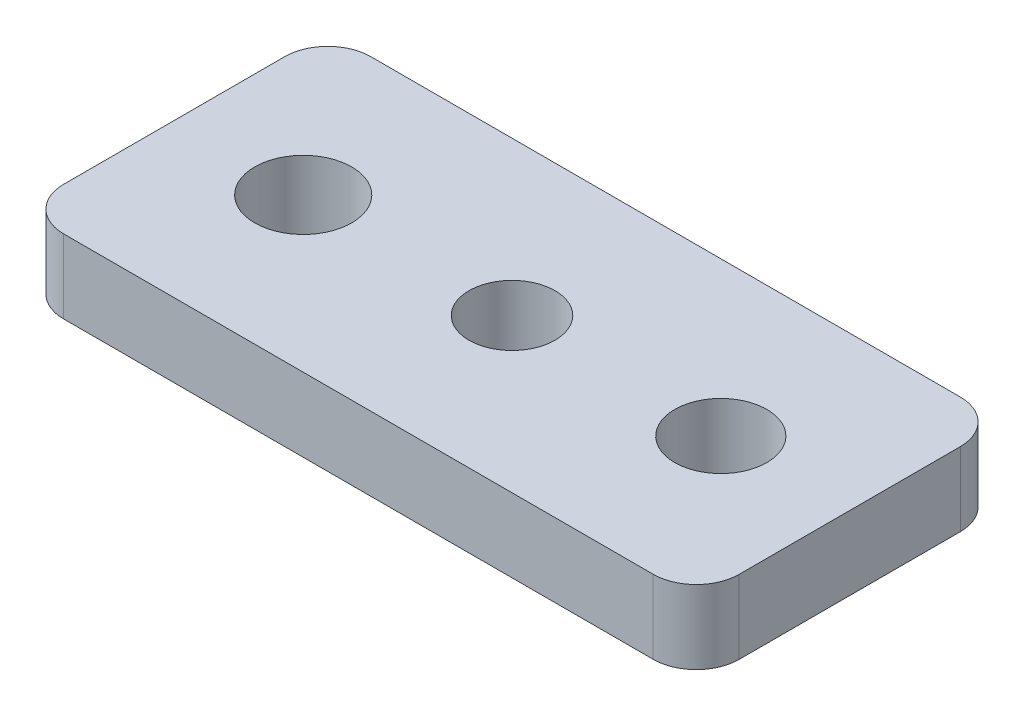
ISO-10303-21;
HEADER;
FILE_DESCRIPTION(('STEP AP214'),'2;1');
FILE_NAME('part.step','',(''),(''),'','','');
FILE_SCHEMA(('AUTOMOTIVE_DESIGN { 1 0 10303 214 1 1 1 1 }'));
ENDSEC;
DATA;
#1=APPLICATION_CONTEXT('core data for automotive mechanical design processes');
#2=APPLICATION_PROTOCOL_DEFINITION('international standard','automotive_design',2000,#1);
#3=PRODUCT_CONTEXT('',#1,'mechanical');
#4=PRODUCT('Part','Part','',(#3));
#5=PRODUCT_RELATED_PRODUCT_CATEGORY('part','',(#4));
#6=PRODUCT_DEFINITION_FORMATION('','',#4);
#7=PRODUCT_DEFINITION_CONTEXT('part definition',#1,'design');
#8=PRODUCT_DEFINITION('design','',#6,#7);
#9=PRODUCT_DEFINITION_SHAPE('','',#8);
#10=(LENGTH_UNIT() NAMED_UNIT(*) SI_UNIT(.MILLI.,.METRE.));
#11=(NAMED_UNIT(*) PLANE_ANGLE_UNIT() SI_UNIT($,.RADIAN.));
#12=(NAMED_UNIT(*) SI_UNIT($,.STERADIAN.) SOLID_ANGLE_UNIT());
#13=UNCERTAINTY_MEASURE_WITH_UNIT(LENGTH_MEASURE(1.E-05),#10,'distance_accuracy_value','');
#14=(GEOMETRIC_REPRESENTATION_CONTEXT(3) GLOBAL_UNCERTAINTY_ASSIGNED_CONTEXT((#13)) GLOBAL_UNIT_ASSIGNED_CONTEXT((#10,
#11,#12)) REPRESENTATION_CONTEXT('',''));
#15=CARTESIAN_POINT('',(0.,0.,0.));
#16=DIRECTION('',(0.,0.,1.));
#17=DIRECTION('',(1.,0.,0.));
#18=AXIS2_PLACEMENT_3D('',#15,#16,#17);
#19=CARTESIAN_POINT('',(27.5,6.,-12.5));
#20=DIRECTION('',(-1.,0.,0.));
#21=DIRECTION('',(0.,0.,1.));
#22=AXIS2_PLACEMENT_3D('',#19,#20,#21);
#23=PLANE('',#22);
#24=DIRECTION('',(0.,0.,-1.));
#25=VECTOR('',#24,1.);
#26=CARTESIAN_POINT('',(27.5,0.,-12.5));
#27=LINE('',#26,#25);
#28=CARTESIAN_POINT('',(27.5,0.,9.));
#29=VERTEX_POINT('',#28);
#30=CARTESIAN_POINT('',(27.5,0.,-9.00000000000001));
#31=VERTEX_POINT('',#30);
#32=EDGE_CURVE('E126',#29,#31,#27,.T.);
#33=ORIENTED_EDGE('',*,*,#32,.T.);
#34=DIRECTION('',(0.,-1.,0.));
#35=VECTOR('',#34,1.);
#36=CARTESIAN_POINT('',(27.5,6.,-9.00000000000001));
#37=LINE('',#36,#35);
#38=CARTESIAN_POINT('',(27.5,6.,-9.00000000000001));
#39=VERTEX_POINT('',#38);
#40=EDGE_CURVE('E104',#31,#39,#37,.F.);
#41=ORIENTED_EDGE('',*,*,#40,.T.);
#42=DIRECTION('',(0.,0.,-1.));
#43=VECTOR('',#42,1.);
#44=CARTESIAN_POINT('',(27.5,6.,-12.5));
#45=LINE('',#44,#43);
#46=CARTESIAN_POINT('',(27.5,6.,9.));
#47=VERTEX_POINT('',#46);
#48=EDGE_CURVE('E136',#47,#39,#45,.T.);
#49=ORIENTED_EDGE('',*,*,#48,.F.);
#50=DIRECTION('',(0.,-1.,0.));
#51=VECTOR('',#50,1.);
#52=CARTESIAN_POINT('',(27.5,6.,9.));
#53=LINE('',#52,#51);
#54=EDGE_CURVE('E109',#47,#29,#53,.T.);
#55=ORIENTED_EDGE('',*,*,#54,.T.);
#56=EDGE_LOOP('',(#33,#41,#49,#55));
#57=FACE_BOUND('',#56,.T.);
#58=ADVANCED_FACE('F33',(#57),#23,.F.);
#59=CARTESIAN_POINT('',(-27.5,6.,-12.5));
#60=DIRECTION('',(0.,0.,1.));
#61=DIRECTION('',(1.,0.,0.));
#62=AXIS2_PLACEMENT_3D('',#59,#60,#61);
#63=PLANE('',#62);
#64=DIRECTION('',(-1.,0.,0.));
#65=VECTOR('',#64,1.);
#66=CARTESIAN_POINT('',(-27.5,6.,-12.5));
#67=LINE('',#66,#65);
#68=CARTESIAN_POINT('',(24.,6.,-12.5));
#69=VERTEX_POINT('',#68);
#70=CARTESIAN_POINT('',(-24.,6.,-12.5));
#71=VERTEX_POINT('',#70);
#72=EDGE_CURVE('E119',#69,#71,#67,.T.);
#73=ORIENTED_EDGE('',*,*,#72,.F.);
#74=DIRECTION('',(0.,-1.,0.));
#75=VECTOR('',#74,1.);
#76=CARTESIAN_POINT('',(24.,6.,-12.5));
#77=LINE('',#76,#75);
#78=CARTESIAN_POINT('',(24.,0.,-12.5));
#79=VERTEX_POINT('',#78);
#80=EDGE_CURVE('E103',#69,#79,#77,.T.);
#81=ORIENTED_EDGE('',*,*,#80,.T.);
#82=DIRECTION('',(-1.,0.,0.));
#83=VECTOR('',#82,1.);
#84=CARTESIAN_POINT('',(-27.5,0.,-12.5));
#85=LINE('',#84,#83);
#86=CARTESIAN_POINT('',(-24.,0.,-12.5));
#87=VERTEX_POINT('',#86);
#88=EDGE_CURVE('E116',#79,#87,#85,.T.);
#89=ORIENTED_EDGE('',*,*,#88,.T.);
#90=DIRECTION('',(0.,-1.,0.));
#91=VECTOR('',#90,1.);
#92=CARTESIAN_POINT('',(-24.,6.,-12.5));
#93=LINE('',#92,#91);
#94=EDGE_CURVE('E121',#87,#71,#93,.F.);
#95=ORIENTED_EDGE('',*,*,#94,.T.);
#96=EDGE_LOOP('',(#73,#81,#89,#95));
#97=FACE_BOUND('',#96,.T.);
#98=ADVANCED_FACE('F115',(#97),#63,.F.);
#99=CARTESIAN_POINT('',(-27.5,6.,-12.5));
#100=DIRECTION('',(1.,0.,0.));
#101=DIRECTION('',(0.,0.,-1.));
#102=AXIS2_PLACEMENT_3D('',#99,#100,#101);
#103=PLANE('',#102);
#104=DIRECTION('',(0.,0.,1.));
#105=VECTOR('',#104,1.);
#106=CARTESIAN_POINT('',(-27.5,6.,-12.5));
#107=LINE('',#106,#105);
#108=CARTESIAN_POINT('',(-27.5,6.,-9.00000000000001));
#109=VERTEX_POINT('',#108);
#110=CARTESIAN_POINT('',(-27.5,6.,9.));
#111=VERTEX_POINT('',#110);
#112=EDGE_CURVE('E162',#109,#111,#107,.T.);
#113=ORIENTED_EDGE('',*,*,#112,.F.);
#114=DIRECTION('',(0.,-1.,0.));
#115=VECTOR('',#114,1.);
#116=CARTESIAN_POINT('',(-27.5,6.,-9.00000000000001));
#117=LINE('',#116,#115);
#118=CARTESIAN_POINT('',(-27.5,0.,-9.00000000000001));
#119=VERTEX_POINT('',#118);
#120=EDGE_CURVE('E155',#109,#119,#117,.T.);
#121=ORIENTED_EDGE('',*,*,#120,.T.);
#122=DIRECTION('',(0.,0.,1.));
#123=VECTOR('',#122,1.);
#124=CARTESIAN_POINT('',(-27.5,0.,-12.5));
#125=LINE('',#124,#123);
#126=CARTESIAN_POINT('',(-27.5,0.,9.));
#127=VERTEX_POINT('',#126);
#128=EDGE_CURVE('E125',#119,#127,#125,.T.);
#129=ORIENTED_EDGE('',*,*,#128,.T.);
#130=DIRECTION('',(0.,-1.,0.));
#131=VECTOR('',#130,1.);
#132=CARTESIAN_POINT('',(-27.5,6.,9.));
#133=LINE('',#132,#131);
#134=EDGE_CURVE('E153',#127,#111,#133,.F.);
#135=ORIENTED_EDGE('',*,*,#134,.T.);
#136=EDGE_LOOP('',(#113,#121,#129,#135));
#137=FACE_BOUND('',#136,.T.);
#138=ADVANCED_FACE('F160',(#137),#103,.F.);
#139=CARTESIAN_POINT('',(-27.5,6.,12.5));
#140=DIRECTION('',(0.,0.,-1.));
#141=DIRECTION('',(-1.,0.,0.));
#142=AXIS2_PLACEMENT_3D('',#139,#140,#141);
#143=PLANE('',#142);
#144=DIRECTION('',(1.,0.,0.));
#145=VECTOR('',#144,1.);
#146=CARTESIAN_POINT('',(-27.5,6.,12.5));
#147=LINE('',#146,#145);
#148=CARTESIAN_POINT('',(-24.,6.,12.5));
#149=VERTEX_POINT('',#148);
#150=CARTESIAN_POINT('',(24.,6.,12.5));
#151=VERTEX_POINT('',#150);
#152=EDGE_CURVE('E137',#149,#151,#147,.T.);
#153=ORIENTED_EDGE('',*,*,#152,.F.);
#154=DIRECTION('',(0.,-1.,0.));
#155=VECTOR('',#154,1.);
#156=CARTESIAN_POINT('',(-24.,6.,12.5));
#157=LINE('',#156,#155);
#158=CARTESIAN_POINT('',(-24.,0.,12.5));
#159=VERTEX_POINT('',#158);
#160=EDGE_CURVE('E11',#149,#159,#157,.T.);
#161=ORIENTED_EDGE('',*,*,#160,.T.);
#162=DIRECTION('',(1.,0.,0.));
#163=VECTOR('',#162,1.);
#164=CARTESIAN_POINT('',(-27.5,0.,12.5));
#165=LINE('',#164,#163);
#166=CARTESIAN_POINT('',(24.,0.,12.5));
#167=VERTEX_POINT('',#166);
#168=EDGE_CURVE('E129',#159,#167,#165,.T.);
#169=ORIENTED_EDGE('',*,*,#168,.T.);
#170=DIRECTION('',(0.,-1.,0.));
#171=VECTOR('',#170,1.);
#172=CARTESIAN_POINT('',(24.,6.,12.5));
#173=LINE('',#172,#171);
#174=EDGE_CURVE('E41',#167,#151,#173,.F.);
#175=ORIENTED_EDGE('',*,*,#174,.T.);
#176=EDGE_LOOP('',(#153,#161,#169,#175));
#177=FACE_BOUND('',#176,.T.);
#178=ADVANCED_FACE('F169',(#177),#143,.F.);
#179=CARTESIAN_POINT('',(0.,6.,0.));
#180=DIRECTION('',(0.,1.,0.));
#181=DIRECTION('',(0.,0.,1.));
#182=AXIS2_PLACEMENT_3D('',#179,#180,#181);
#183=PLANE('',#182);
#184=CARTESIAN_POINT('',(-17.,6.,0.));
#185=DIRECTION('',(0.,1.,0.));
#186=DIRECTION('',(0.,0.,1.));
#187=AXIS2_PLACEMENT_3D('',#184,#185,#186);
#188=CIRCLE('',#187,3.95);
#189=CARTESIAN_POINT('',(-17.,6.,3.95));
#190=VERTEX_POINT('',#189);
#191=EDGE_CURVE('E182',#190,#190,#188,.T.);
#192=ORIENTED_EDGE('',*,*,#191,.F.);
#193=EDGE_LOOP('',(#192));
#194=FACE_BOUND('',#193,.T.);
#195=CARTESIAN_POINT('',(17.,6.,0.));
#196=DIRECTION('',(0.,1.,0.));
#197=DIRECTION('',(0.,0.,1.));
#198=AXIS2_PLACEMENT_3D('',#195,#196,#197);
#199=CIRCLE('',#198,3.75);
#200=CARTESIAN_POINT('',(17.,6.,3.75));
#201=VERTEX_POINT('',#200);
#202=EDGE_CURVE('E188',#201,#201,#199,.T.);
#203=ORIENTED_EDGE('',*,*,#202,.F.);
#204=EDGE_LOOP('',(#203));
#205=FACE_BOUND('',#204,.T.);
#206=CARTESIAN_POINT('',(0.,6.,0.));
#207=DIRECTION('',(0.,1.,0.));
#208=DIRECTION('',(0.,0.,1.));
#209=AXIS2_PLACEMENT_3D('',#206,#207,#208);
#210=CIRCLE('',#209,3.5);
#211=CARTESIAN_POINT('',(0.,6.,3.5));
#212=VERTEX_POINT('',#211);
#213=EDGE_CURVE('E176',#212,#212,#210,.T.);
#214=ORIENTED_EDGE('',*,*,#213,.F.);
#215=EDGE_LOOP('',(#214));
#216=FACE_BOUND('',#215,.T.);
#217=ORIENTED_EDGE('',*,*,#48,.T.);
#218=CARTESIAN_POINT('',(24.,6.,-9.00000000000001));
#219=DIRECTION('',(0.,1.,0.));
#220=DIRECTION('',(0.,0.,1.));
#221=AXIS2_PLACEMENT_3D('',#218,#219,#220);
#222=CIRCLE('',#221,3.5);
#223=EDGE_CURVE('E151',#39,#69,#222,.T.);
#224=ORIENTED_EDGE('',*,*,#223,.T.);
#225=ORIENTED_EDGE('',*,*,#72,.T.);
#226=CARTESIAN_POINT('',(-24.,6.,-9.00000000000001));
#227=DIRECTION('',(0.,1.,0.));
#228=DIRECTION('',(0.,0.,1.));
#229=AXIS2_PLACEMENT_3D('',#226,#227,#228);
#230=CIRCLE('',#229,3.5);
#231=EDGE_CURVE('E149',#71,#109,#230,.T.);
#232=ORIENTED_EDGE('',*,*,#231,.T.);
#233=ORIENTED_EDGE('',*,*,#112,.T.);
#234=CARTESIAN_POINT('',(-24.,6.,9.));
#235=DIRECTION('',(0.,1.,0.));
#236=DIRECTION('',(0.,0.,1.));
#237=AXIS2_PLACEMENT_3D('',#234,#235,#236);
#238=CIRCLE('',#237,3.5);
#239=EDGE_CURVE('E54',#111,#149,#238,.T.);
#240=ORIENTED_EDGE('',*,*,#239,.T.);
#241=ORIENTED_EDGE('',*,*,#152,.T.);
#242=CARTESIAN_POINT('',(24.,6.,9.));
#243=DIRECTION('',(0.,1.,0.));
#244=DIRECTION('',(0.,0.,1.));
#245=AXIS2_PLACEMENT_3D('',#242,#243,#244);
#246=CIRCLE('',#245,3.5);
#247=EDGE_CURVE('E146',#151,#47,#246,.T.);
#248=ORIENTED_EDGE('',*,*,#247,.T.);
#249=EDGE_LOOP('',(#217,#224,#225,#232,#233,#240,#241,#248));
#250=FACE_BOUND('',#249,.T.);
#251=ADVANCED_FACE('F204',(#194,#205,#216,#250),#183,.T.);
#252=CARTESIAN_POINT('',(0.,0.,0.));
#253=DIRECTION('',(0.,1.,0.));
#254=DIRECTION('',(0.,0.,1.));
#255=AXIS2_PLACEMENT_3D('',#252,#253,#254);
#256=PLANE('',#255);
#257=CARTESIAN_POINT('',(-17.,0.,0.));
#258=DIRECTION('',(0.,1.,0.));
#259=DIRECTION('',(0.,0.,1.));
#260=AXIS2_PLACEMENT_3D('',#257,#258,#259);
#261=CIRCLE('',#260,3.95);
#262=CARTESIAN_POINT('',(-17.,0.,3.95));
#263=VERTEX_POINT('',#262);
#264=EDGE_CURVE('E185',#263,#263,#261,.T.);
#265=ORIENTED_EDGE('',*,*,#264,.T.);
#266=EDGE_LOOP('',(#265));
#267=FACE_BOUND('',#266,.T.);
#268=CARTESIAN_POINT('',(17.,0.,0.));
#269=DIRECTION('',(0.,1.,0.));
#270=DIRECTION('',(0.,0.,1.));
#271=AXIS2_PLACEMENT_3D('',#268,#269,#270);
#272=CIRCLE('',#271,3.75);
#273=CARTESIAN_POINT('',(17.,0.,3.75));
#274=VERTEX_POINT('',#273);
#275=EDGE_CURVE('E179',#274,#274,#272,.T.);
#276=ORIENTED_EDGE('',*,*,#275,.T.);
#277=EDGE_LOOP('',(#276));
#278=FACE_BOUND('',#277,.T.);
#279=CARTESIAN_POINT('',(0.,0.,0.));
#280=DIRECTION('',(0.,1.,0.));
#281=DIRECTION('',(0.,0.,1.));
#282=AXIS2_PLACEMENT_3D('',#279,#280,#281);
#283=CIRCLE('',#282,3.5);
#284=CARTESIAN_POINT('',(0.,0.,3.5));
#285=VERTEX_POINT('',#284);
#286=EDGE_CURVE('E131',#285,#285,#283,.T.);
#287=ORIENTED_EDGE('',*,*,#286,.T.);
#288=EDGE_LOOP('',(#287));
#289=FACE_BOUND('',#288,.T.);
#290=ORIENTED_EDGE('',*,*,#88,.F.);
#291=CARTESIAN_POINT('',(24.,0.,-9.00000000000001));
#292=DIRECTION('',(0.,1.,0.));
#293=DIRECTION('',(0.,0.,1.));
#294=AXIS2_PLACEMENT_3D('',#291,#292,#293);
#295=CIRCLE('',#294,3.5);
#296=EDGE_CURVE('E99',#79,#31,#295,.F.);
#297=ORIENTED_EDGE('',*,*,#296,.T.);
#298=ORIENTED_EDGE('',*,*,#32,.F.);
#299=CARTESIAN_POINT('',(24.,0.,9.));
#300=DIRECTION('',(0.,1.,0.));
#301=DIRECTION('',(0.,0.,1.));
#302=AXIS2_PLACEMENT_3D('',#299,#300,#301);
#303=CIRCLE('',#302,3.5);
#304=EDGE_CURVE('E120',#29,#167,#303,.F.);
#305=ORIENTED_EDGE('',*,*,#304,.T.);
#306=ORIENTED_EDGE('',*,*,#168,.F.);
#307=CARTESIAN_POINT('',(-24.,0.,9.));
#308=DIRECTION('',(0.,1.,0.));
#309=DIRECTION('',(0.,0.,1.));
#310=AXIS2_PLACEMENT_3D('',#307,#308,#309);
#311=CIRCLE('',#310,3.5);
#312=EDGE_CURVE('E140',#159,#127,#311,.F.);
#313=ORIENTED_EDGE('',*,*,#312,.T.);
#314=ORIENTED_EDGE('',*,*,#128,.F.);
#315=CARTESIAN_POINT('',(-24.,0.,-9.00000000000001));
#316=DIRECTION('',(0.,1.,0.));
#317=DIRECTION('',(0.,0.,1.));
#318=AXIS2_PLACEMENT_3D('',#315,#316,#317);
#319=CIRCLE('',#318,3.5);
#320=EDGE_CURVE('E110',#119,#87,#319,.F.);
#321=ORIENTED_EDGE('',*,*,#320,.T.);
#322=EDGE_LOOP('',(#290,#297,#298,#305,#306,#313,#314,#321));
#323=FACE_BOUND('',#322,.T.);
#324=ADVANCED_FACE('F123',(#267,#278,#289,#323),#256,.F.);
#325=CARTESIAN_POINT('',(0.,0.,0.));
#326=DIRECTION('',(0.,1.,0.));
#327=DIRECTION('',(0.,0.,1.));
#328=AXIS2_PLACEMENT_3D('',#325,#326,#327);
#329=CYLINDRICAL_SURFACE('',#328,3.5);
#330=ORIENTED_EDGE('',*,*,#286,.F.);
#331=EDGE_LOOP('',(#330));
#332=FACE_BOUND('',#331,.T.);
#333=ORIENTED_EDGE('',*,*,#213,.T.);
#334=EDGE_LOOP('',(#333));
#335=FACE_BOUND('',#334,.T.);
#336=ADVANCED_FACE('F200',(#332,#335),#329,.F.);
#337=CARTESIAN_POINT('',(17.,0.,0.));
#338=DIRECTION('',(0.,1.,0.));
#339=DIRECTION('',(0.,0.,1.));
#340=AXIS2_PLACEMENT_3D('',#337,#338,#339);
#341=CYLINDRICAL_SURFACE('',#340,3.75);
#342=ORIENTED_EDGE('',*,*,#275,.F.);
#343=EDGE_LOOP('',(#342));
#344=FACE_BOUND('',#343,.T.);
#345=ORIENTED_EDGE('',*,*,#202,.T.);
#346=EDGE_LOOP('',(#345));
#347=FACE_BOUND('',#346,.T.);
#348=ADVANCED_FACE('F196',(#344,#347),#341,.F.);
#349=CARTESIAN_POINT('',(-17.,0.,0.));
#350=DIRECTION('',(0.,1.,0.));
#351=DIRECTION('',(0.,0.,1.));
#352=AXIS2_PLACEMENT_3D('',#349,#350,#351);
#353=CYLINDRICAL_SURFACE('',#352,3.95);
#354=ORIENTED_EDGE('',*,*,#264,.F.);
#355=EDGE_LOOP('',(#354));
#356=FACE_BOUND('',#355,.T.);
#357=ORIENTED_EDGE('',*,*,#191,.T.);
#358=EDGE_LOOP('',(#357));
#359=FACE_BOUND('',#358,.T.);
#360=ADVANCED_FACE('F199',(#356,#359),#353,.F.);
#361=CARTESIAN_POINT('',(24.,6.,-9.00000000000001));
#362=DIRECTION('',(0.,-1.,0.));
#363=DIRECTION('',(0.,0.,-1.));
#364=AXIS2_PLACEMENT_3D('',#361,#362,#363);
#365=CYLINDRICAL_SURFACE('',#364,3.5);
#366=ORIENTED_EDGE('',*,*,#223,.F.);
#367=ORIENTED_EDGE('',*,*,#40,.F.);
#368=ORIENTED_EDGE('',*,*,#296,.F.);
#369=ORIENTED_EDGE('',*,*,#80,.F.);
#370=EDGE_LOOP('',(#366,#367,#368,#369));
#371=FACE_BOUND('',#370,.T.);
#372=ADVANCED_FACE('F102',(#371),#365,.T.);
#373=CARTESIAN_POINT('',(-24.,6.,-9.00000000000001));
#374=DIRECTION('',(0.,-1.,0.));
#375=DIRECTION('',(0.,0.,-1.));
#376=AXIS2_PLACEMENT_3D('',#373,#374,#375);
#377=CYLINDRICAL_SURFACE('',#376,3.5);
#378=ORIENTED_EDGE('',*,*,#231,.F.);
#379=ORIENTED_EDGE('',*,*,#94,.F.);
#380=ORIENTED_EDGE('',*,*,#320,.F.);
#381=ORIENTED_EDGE('',*,*,#120,.F.);
#382=EDGE_LOOP('',(#378,#379,#380,#381));
#383=FACE_BOUND('',#382,.T.);
#384=ADVANCED_FACE('F218',(#383),#377,.T.);
#385=CARTESIAN_POINT('',(-24.,6.,9.));
#386=DIRECTION('',(0.,-1.,0.));
#387=DIRECTION('',(0.,0.,-1.));
#388=AXIS2_PLACEMENT_3D('',#385,#386,#387);
#389=CYLINDRICAL_SURFACE('',#388,3.5);
#390=ORIENTED_EDGE('',*,*,#239,.F.);
#391=ORIENTED_EDGE('',*,*,#134,.F.);
#392=ORIENTED_EDGE('',*,*,#312,.F.);
#393=ORIENTED_EDGE('',*,*,#160,.F.);
#394=EDGE_LOOP('',(#390,#391,#392,#393));
#395=FACE_BOUND('',#394,.T.);
#396=ADVANCED_FACE('F168',(#395),#389,.T.);
#397=CARTESIAN_POINT('',(24.,6.,9.));
#398=DIRECTION('',(0.,-1.,0.));
#399=DIRECTION('',(0.,0.,-1.));
#400=AXIS2_PLACEMENT_3D('',#397,#398,#399);
#401=CYLINDRICAL_SURFACE('',#400,3.5);
#402=ORIENTED_EDGE('',*,*,#247,.F.);
#403=ORIENTED_EDGE('',*,*,#174,.F.);
#404=ORIENTED_EDGE('',*,*,#304,.F.);
#405=ORIENTED_EDGE('',*,*,#54,.F.);
#406=EDGE_LOOP('',(#402,#403,#404,#405));
#407=FACE_BOUND('',#406,.T.);
#408=ADVANCED_FACE('F35',(#407),#401,.T.);
#409=CLOSED_SHELL('',(#58,#98,#138,#178,#251,#324,#336,#348,#360,#372,#384,#396,#408));
#410=MANIFOLD_SOLID_BREP('B2',#409);
#411=ADVANCED_BREP_SHAPE_REPRESENTATION('',(#18,#410),#14);
#412=SHAPE_DEFINITION_REPRESENTATION(#9,#411);
ENDSEC;
END-ISO-10303-21;
